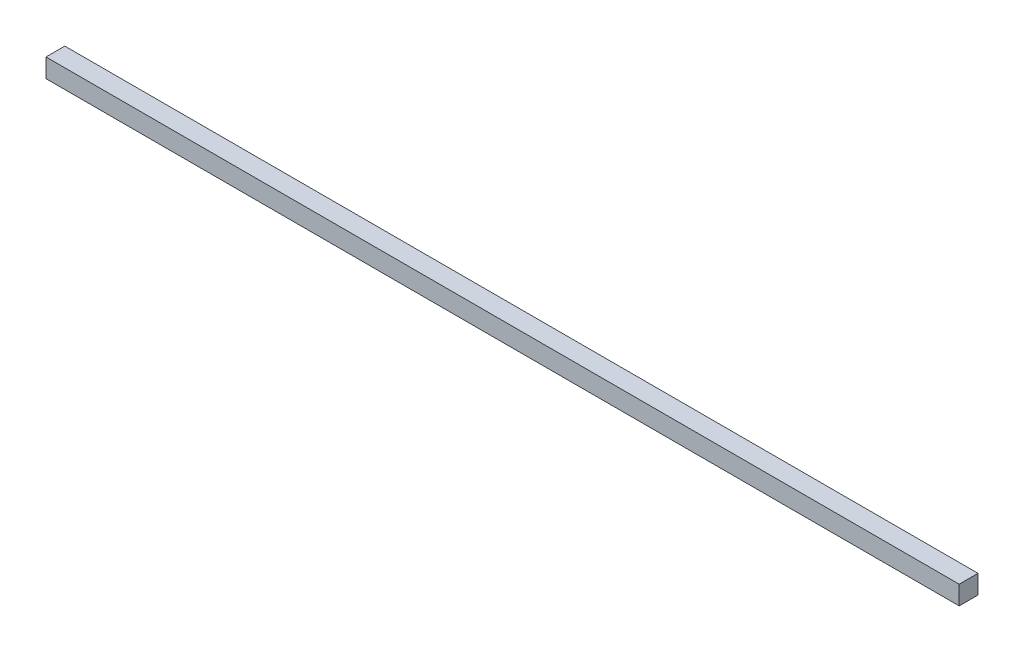
ISO-10303-21;
HEADER;
FILE_DESCRIPTION(('STEP AP214'),'2;1');
FILE_NAME('part.step','',(''),(''),'','','');
FILE_SCHEMA(('AUTOMOTIVE_DESIGN { 1 0 10303 214 1 1 1 1 }'));
ENDSEC;
DATA;
#1=APPLICATION_CONTEXT('core data for automotive mechanical design processes');
#2=APPLICATION_PROTOCOL_DEFINITION('international standard','automotive_design',2000,#1);
#3=PRODUCT_CONTEXT('',#1,'mechanical');
#4=PRODUCT('Part','Part','',(#3));
#5=PRODUCT_RELATED_PRODUCT_CATEGORY('part','',(#4));
#6=PRODUCT_DEFINITION_FORMATION('','',#4);
#7=PRODUCT_DEFINITION_CONTEXT('part definition',#1,'design');
#8=PRODUCT_DEFINITION('design','',#6,#7);
#9=PRODUCT_DEFINITION_SHAPE('','',#8);
#10=(LENGTH_UNIT() NAMED_UNIT(*) SI_UNIT(.MILLI.,.METRE.));
#11=(NAMED_UNIT(*) PLANE_ANGLE_UNIT() SI_UNIT($,.RADIAN.));
#12=(NAMED_UNIT(*) SI_UNIT($,.STERADIAN.) SOLID_ANGLE_UNIT());
#13=UNCERTAINTY_MEASURE_WITH_UNIT(LENGTH_MEASURE(1.E-05),#10,'distance_accuracy_value','');
#14=(GEOMETRIC_REPRESENTATION_CONTEXT(3) GLOBAL_UNCERTAINTY_ASSIGNED_CONTEXT((#13)) GLOBAL_UNIT_ASSIGNED_CONTEXT((#10,
#11,#12)) REPRESENTATION_CONTEXT('',''));
#15=CARTESIAN_POINT('',(0.,0.,0.));
#16=DIRECTION('',(0.,0.,1.));
#17=DIRECTION('',(1.,0.,0.));
#18=AXIS2_PLACEMENT_3D('',#15,#16,#17);
#19=CARTESIAN_POINT('',(307.975,0.,0.));
#20=DIRECTION('',(0.,0.,-1.));
#21=DIRECTION('',(-1.,0.,0.));
#22=AXIS2_PLACEMENT_3D('',#19,#20,#21);
#23=PLANE('',#22);
#24=DIRECTION('',(0.,-1.,0.));
#25=VECTOR('',#24,1.);
#26=CARTESIAN_POINT('',(0.,0.,0.));
#27=LINE('',#26,#25);
#28=CARTESIAN_POINT('',(0.,6.35,0.));
#29=VERTEX_POINT('',#28);
#30=CARTESIAN_POINT('',(0.,0.,0.));
#31=VERTEX_POINT('',#30);
#32=EDGE_CURVE('E123',#29,#31,#27,.T.);
#33=ORIENTED_EDGE('',*,*,#32,.T.);
#34=DIRECTION('',(-1.,0.,0.));
#35=VECTOR('',#34,1.);
#36=CARTESIAN_POINT('',(307.975,0.,0.));
#37=LINE('',#36,#35);
#38=CARTESIAN_POINT('',(307.975,0.,0.));
#39=VERTEX_POINT('',#38);
#40=EDGE_CURVE('E11',#39,#31,#37,.T.);
#41=ORIENTED_EDGE('',*,*,#40,.F.);
#42=DIRECTION('',(0.,-1.,0.));
#43=VECTOR('',#42,1.);
#44=CARTESIAN_POINT('',(307.975,0.,0.));
#45=LINE('',#44,#43);
#46=CARTESIAN_POINT('',(307.975,6.35,0.));
#47=VERTEX_POINT('',#46);
#48=EDGE_CURVE('E105',#47,#39,#45,.T.);
#49=ORIENTED_EDGE('',*,*,#48,.F.);
#50=DIRECTION('',(-1.,0.,0.));
#51=VECTOR('',#50,1.);
#52=CARTESIAN_POINT('',(307.975,6.35,0.));
#53=LINE('',#52,#51);
#54=EDGE_CURVE('E119',#47,#29,#53,.T.);
#55=ORIENTED_EDGE('',*,*,#54,.T.);
#56=EDGE_LOOP('',(#33,#41,#49,#55));
#57=FACE_BOUND('',#56,.T.);
#58=ADVANCED_FACE('F45',(#57),#23,.F.);
#59=CARTESIAN_POINT('',(307.975,0.,0.));
#60=DIRECTION('',(0.,1.,0.));
#61=DIRECTION('',(0.,0.,1.));
#62=AXIS2_PLACEMENT_3D('',#59,#60,#61);
#63=PLANE('',#62);
#64=DIRECTION('',(0.,0.,-1.));
#65=VECTOR('',#64,1.);
#66=CARTESIAN_POINT('',(0.,0.,0.));
#67=LINE('',#66,#65);
#68=CARTESIAN_POINT('',(0.,0.,-6.35));
#69=VERTEX_POINT('',#68);
#70=EDGE_CURVE('E110',#31,#69,#67,.T.);
#71=ORIENTED_EDGE('',*,*,#70,.T.);
#72=DIRECTION('',(-1.,0.,0.));
#73=VECTOR('',#72,1.);
#74=CARTESIAN_POINT('',(307.975,0.,-6.35));
#75=LINE('',#74,#73);
#76=CARTESIAN_POINT('',(307.975,0.,-6.35));
#77=VERTEX_POINT('',#76);
#78=EDGE_CURVE('E54',#77,#69,#75,.T.);
#79=ORIENTED_EDGE('',*,*,#78,.F.);
#80=DIRECTION('',(0.,0.,-1.));
#81=VECTOR('',#80,1.);
#82=CARTESIAN_POINT('',(307.975,0.,0.));
#83=LINE('',#82,#81);
#84=EDGE_CURVE('E100',#39,#77,#83,.T.);
#85=ORIENTED_EDGE('',*,*,#84,.F.);
#86=ORIENTED_EDGE('',*,*,#40,.T.);
#87=EDGE_LOOP('',(#71,#79,#85,#86));
#88=FACE_BOUND('',#87,.T.);
#89=ADVANCED_FACE('F109',(#88),#63,.F.);
#90=CARTESIAN_POINT('',(307.975,0.,-6.35));
#91=DIRECTION('',(0.,0.,1.));
#92=DIRECTION('',(1.,0.,0.));
#93=AXIS2_PLACEMENT_3D('',#90,#91,#92);
#94=PLANE('',#93);
#95=DIRECTION('',(0.,1.,0.));
#96=VECTOR('',#95,1.);
#97=CARTESIAN_POINT('',(0.,0.,-6.35));
#98=LINE('',#97,#96);
#99=CARTESIAN_POINT('',(0.,6.35,-6.35));
#100=VERTEX_POINT('',#99);
#101=EDGE_CURVE('E86',#69,#100,#98,.T.);
#102=ORIENTED_EDGE('',*,*,#101,.T.);
#103=DIRECTION('',(-1.,0.,0.));
#104=VECTOR('',#103,1.);
#105=CARTESIAN_POINT('',(307.975,6.35,-6.35));
#106=LINE('',#105,#104);
#107=CARTESIAN_POINT('',(307.975,6.35,-6.35));
#108=VERTEX_POINT('',#107);
#109=EDGE_CURVE('E112',#108,#100,#106,.T.);
#110=ORIENTED_EDGE('',*,*,#109,.F.);
#111=DIRECTION('',(0.,1.,0.));
#112=VECTOR('',#111,1.);
#113=CARTESIAN_POINT('',(307.975,0.,-6.35));
#114=LINE('',#113,#112);
#115=EDGE_CURVE('E103',#77,#108,#114,.T.);
#116=ORIENTED_EDGE('',*,*,#115,.F.);
#117=ORIENTED_EDGE('',*,*,#78,.T.);
#118=EDGE_LOOP('',(#102,#110,#116,#117));
#119=FACE_BOUND('',#118,.T.);
#120=ADVANCED_FACE('F113',(#119),#94,.F.);
#121=CARTESIAN_POINT('',(307.975,6.35,0.));
#122=DIRECTION('',(0.,-1.,0.));
#123=DIRECTION('',(0.,0.,-1.));
#124=AXIS2_PLACEMENT_3D('',#121,#122,#123);
#125=PLANE('',#124);
#126=DIRECTION('',(0.,0.,1.));
#127=VECTOR('',#126,1.);
#128=CARTESIAN_POINT('',(0.,6.35,0.));
#129=LINE('',#128,#127);
#130=EDGE_CURVE('E92',#100,#29,#129,.T.);
#131=ORIENTED_EDGE('',*,*,#130,.T.);
#132=ORIENTED_EDGE('',*,*,#54,.F.);
#133=DIRECTION('',(0.,0.,1.));
#134=VECTOR('',#133,1.);
#135=CARTESIAN_POINT('',(307.975,6.35,0.));
#136=LINE('',#135,#134);
#137=EDGE_CURVE('E65',#108,#47,#136,.T.);
#138=ORIENTED_EDGE('',*,*,#137,.F.);
#139=ORIENTED_EDGE('',*,*,#109,.T.);
#140=EDGE_LOOP('',(#131,#132,#138,#139));
#141=FACE_BOUND('',#140,.T.);
#142=ADVANCED_FACE('F135',(#141),#125,.F.);
#143=CARTESIAN_POINT('',(307.975,0.,0.));
#144=DIRECTION('',(-1.,0.,0.));
#145=DIRECTION('',(0.,0.,1.));
#146=AXIS2_PLACEMENT_3D('',#143,#144,#145);
#147=PLANE('',#146);
#148=ORIENTED_EDGE('',*,*,#48,.T.);
#149=ORIENTED_EDGE('',*,*,#84,.T.);
#150=ORIENTED_EDGE('',*,*,#115,.T.);
#151=ORIENTED_EDGE('',*,*,#137,.T.);
#152=EDGE_LOOP('',(#148,#149,#150,#151));
#153=FACE_BOUND('',#152,.T.);
#154=ADVANCED_FACE('F101',(#153),#147,.F.);
#155=CARTESIAN_POINT('',(0.,0.,0.));
#156=DIRECTION('',(-1.,0.,0.));
#157=DIRECTION('',(0.,0.,1.));
#158=AXIS2_PLACEMENT_3D('',#155,#156,#157);
#159=PLANE('',#158);
#160=ORIENTED_EDGE('',*,*,#32,.F.);
#161=ORIENTED_EDGE('',*,*,#130,.F.);
#162=ORIENTED_EDGE('',*,*,#101,.F.);
#163=ORIENTED_EDGE('',*,*,#70,.F.);
#164=EDGE_LOOP('',(#160,#161,#162,#163));
#165=FACE_BOUND('',#164,.T.);
#166=ADVANCED_FACE('F138',(#165),#159,.T.);
#167=CLOSED_SHELL('',(#58,#89,#120,#142,#154,#166));
#168=MANIFOLD_SOLID_BREP('B2',#167);
#169=ADVANCED_BREP_SHAPE_REPRESENTATION('',(#18,#168),#14);
#170=SHAPE_DEFINITION_REPRESENTATION(#9,#169);
ENDSEC;
END-ISO-10303-21;
